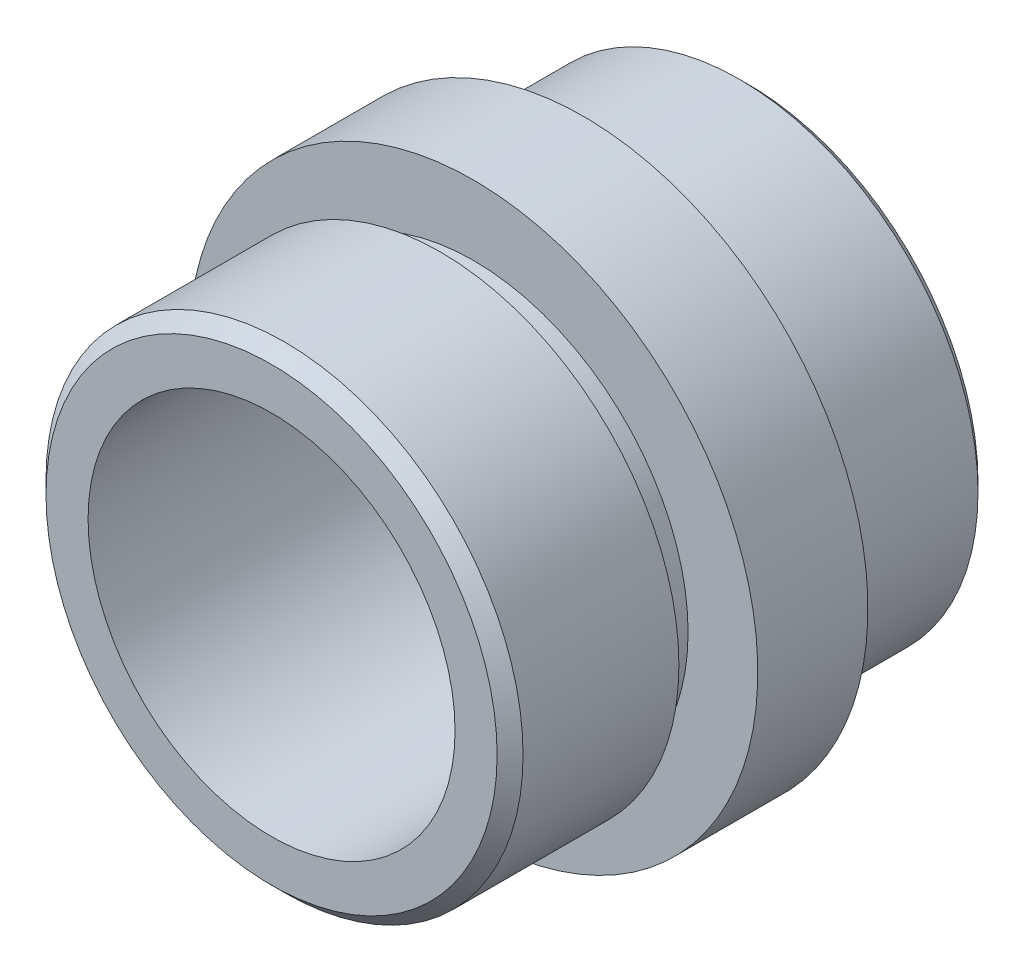
ISO-10303-21;
HEADER;
FILE_DESCRIPTION(('STEP AP214'),'2;1');
FILE_NAME('part.step','',(''),(''),'','','');
FILE_SCHEMA(('AUTOMOTIVE_DESIGN { 1 0 10303 214 1 1 1 1 }'));
ENDSEC;
DATA;
#1=APPLICATION_CONTEXT('core data for automotive mechanical design processes');
#2=APPLICATION_PROTOCOL_DEFINITION('international standard','automotive_design',2000,#1);
#3=PRODUCT_CONTEXT('',#1,'mechanical');
#4=PRODUCT('Part','Part','',(#3));
#5=PRODUCT_RELATED_PRODUCT_CATEGORY('part','',(#4));
#6=PRODUCT_DEFINITION_FORMATION('','',#4);
#7=PRODUCT_DEFINITION_CONTEXT('part definition',#1,'design');
#8=PRODUCT_DEFINITION('design','',#6,#7);
#9=PRODUCT_DEFINITION_SHAPE('','',#8);
#10=(LENGTH_UNIT() NAMED_UNIT(*) SI_UNIT(.MILLI.,.METRE.));
#11=(NAMED_UNIT(*) PLANE_ANGLE_UNIT() SI_UNIT($,.RADIAN.));
#12=(NAMED_UNIT(*) SI_UNIT($,.STERADIAN.) SOLID_ANGLE_UNIT());
#13=UNCERTAINTY_MEASURE_WITH_UNIT(LENGTH_MEASURE(1.E-05),#10,'distance_accuracy_value','');
#14=(GEOMETRIC_REPRESENTATION_CONTEXT(3) GLOBAL_UNCERTAINTY_ASSIGNED_CONTEXT((#13)) GLOBAL_UNIT_ASSIGNED_CONTEXT((#10,
#11,#12)) REPRESENTATION_CONTEXT('',''));
#15=CARTESIAN_POINT('',(0.,0.,0.));
#16=DIRECTION('',(0.,0.,1.));
#17=DIRECTION('',(1.,0.,0.));
#18=AXIS2_PLACEMENT_3D('',#15,#16,#17);
#19=CARTESIAN_POINT('',(0.,0.,26.005));
#20=DIRECTION('',(0.,0.,-1.));
#21=DIRECTION('',(-1.,0.,0.));
#22=AXIS2_PLACEMENT_3D('',#19,#20,#21);
#23=CYLINDRICAL_SURFACE('',#22,11.7);
#24=CARTESIAN_POINT('',(0.,0.,16.8));
#25=DIRECTION('',(0.,0.,-1.));
#26=DIRECTION('',(-1.,0.,0.));
#27=AXIS2_PLACEMENT_3D('',#24,#25,#26);
#28=CIRCLE('',#27,11.7);
#29=CARTESIAN_POINT('',(-11.7,0.,16.8));
#30=VERTEX_POINT('',#29);
#31=EDGE_CURVE('E84',#30,#30,#28,.T.);
#32=ORIENTED_EDGE('',*,*,#31,.T.);
#33=EDGE_LOOP('',(#32));
#34=FACE_BOUND('',#33,.T.);
#35=CARTESIAN_POINT('',(0.,0.,15.));
#36=DIRECTION('',(0.,0.,-1.));
#37=DIRECTION('',(-1.,0.,0.));
#38=AXIS2_PLACEMENT_3D('',#35,#36,#37);
#39=CIRCLE('',#38,11.7);
#40=CARTESIAN_POINT('',(-11.7,0.,15.));
#41=VERTEX_POINT('',#40);
#42=EDGE_CURVE('E10',#41,#41,#39,.T.);
#43=ORIENTED_EDGE('',*,*,#42,.F.);
#44=EDGE_LOOP('',(#43));
#45=FACE_BOUND('',#44,.T.);
#46=ADVANCED_FACE('F35',(#34,#45),#23,.T.);
#47=CARTESIAN_POINT('',(15.5,0.,15.));
#48=DIRECTION('',(0.,0.,1.));
#49=DIRECTION('',(1.,0.,0.));
#50=AXIS2_PLACEMENT_3D('',#47,#48,#49);
#51=PLANE('',#50);
#52=ORIENTED_EDGE('',*,*,#42,.T.);
#53=EDGE_LOOP('',(#52));
#54=FACE_BOUND('',#53,.T.);
#55=CARTESIAN_POINT('',(0.,0.,15.));
#56=DIRECTION('',(0.,0.,-1.));
#57=DIRECTION('',(-1.,0.,0.));
#58=AXIS2_PLACEMENT_3D('',#55,#56,#57);
#59=CIRCLE('',#58,15.5);
#60=CARTESIAN_POINT('',(-15.5,0.,15.));
#61=VERTEX_POINT('',#60);
#62=EDGE_CURVE('E41',#61,#61,#59,.T.);
#63=ORIENTED_EDGE('',*,*,#62,.F.);
#64=EDGE_LOOP('',(#63));
#65=FACE_BOUND('',#64,.T.);
#66=ADVANCED_FACE('F102',(#54,#65),#51,.T.);
#67=CARTESIAN_POINT('',(0.,0.,26.005));
#68=DIRECTION('',(0.,0.,-1.));
#69=DIRECTION('',(-1.,0.,0.));
#70=AXIS2_PLACEMENT_3D('',#67,#68,#69);
#71=CYLINDRICAL_SURFACE('',#70,15.5);
#72=ORIENTED_EDGE('',*,*,#62,.T.);
#73=EDGE_LOOP('',(#72));
#74=FACE_BOUND('',#73,.T.);
#75=CARTESIAN_POINT('',(0.,0.,9.));
#76=DIRECTION('',(0.,0.,-1.));
#77=DIRECTION('',(-1.,0.,0.));
#78=AXIS2_PLACEMENT_3D('',#75,#76,#77);
#79=CIRCLE('',#78,15.5);
#80=CARTESIAN_POINT('',(-15.5,0.,9.));
#81=VERTEX_POINT('',#80);
#82=EDGE_CURVE('E45',#81,#81,#79,.T.);
#83=ORIENTED_EDGE('',*,*,#82,.F.);
#84=EDGE_LOOP('',(#83));
#85=FACE_BOUND('',#84,.T.);
#86=ADVANCED_FACE('F106',(#74,#85),#71,.T.);
#87=CARTESIAN_POINT('',(11.7,0.,9.));
#88=DIRECTION('',(0.,0.,-1.));
#89=DIRECTION('',(-1.,0.,0.));
#90=AXIS2_PLACEMENT_3D('',#87,#88,#89);
#91=PLANE('',#90);
#92=ORIENTED_EDGE('',*,*,#82,.T.);
#93=EDGE_LOOP('',(#92));
#94=FACE_BOUND('',#93,.T.);
#95=CARTESIAN_POINT('',(0.,0.,9.));
#96=DIRECTION('',(0.,0.,-1.));
#97=DIRECTION('',(-1.,0.,0.));
#98=AXIS2_PLACEMENT_3D('',#95,#96,#97);
#99=CIRCLE('',#98,11.7);
#100=CARTESIAN_POINT('',(-11.7,0.,9.));
#101=VERTEX_POINT('',#100);
#102=EDGE_CURVE('E49',#101,#101,#99,.T.);
#103=ORIENTED_EDGE('',*,*,#102,.F.);
#104=EDGE_LOOP('',(#103));
#105=FACE_BOUND('',#104,.T.);
#106=ADVANCED_FACE('F110',(#94,#105),#91,.T.);
#107=CARTESIAN_POINT('',(0.,0.,26.005));
#108=DIRECTION('',(0.,0.,-1.));
#109=DIRECTION('',(-1.,0.,0.));
#110=AXIS2_PLACEMENT_3D('',#107,#108,#109);
#111=CYLINDRICAL_SURFACE('',#110,11.7);
#112=ORIENTED_EDGE('',*,*,#102,.T.);
#113=EDGE_LOOP('',(#112));
#114=FACE_BOUND('',#113,.T.);
#115=CARTESIAN_POINT('',(0.,0.,7.7));
#116=DIRECTION('',(0.,0.,-1.));
#117=DIRECTION('',(-1.,0.,0.));
#118=AXIS2_PLACEMENT_3D('',#115,#116,#117);
#119=CIRCLE('',#118,11.7);
#120=CARTESIAN_POINT('',(-11.7,0.,7.7));
#121=VERTEX_POINT('',#120);
#122=EDGE_CURVE('E54',#121,#121,#119,.T.);
#123=ORIENTED_EDGE('',*,*,#122,.F.);
#124=EDGE_LOOP('',(#123));
#125=FACE_BOUND('',#124,.T.);
#126=ADVANCED_FACE('F116',(#114,#125),#111,.T.);
#127=CARTESIAN_POINT('',(13.,0.,7.7));
#128=DIRECTION('',(0.,0.,1.));
#129=DIRECTION('',(1.,0.,0.));
#130=AXIS2_PLACEMENT_3D('',#127,#128,#129);
#131=PLANE('',#130);
#132=ORIENTED_EDGE('',*,*,#122,.T.);
#133=EDGE_LOOP('',(#132));
#134=FACE_BOUND('',#133,.T.);
#135=CARTESIAN_POINT('',(0.,0.,7.7));
#136=DIRECTION('',(0.,0.,-1.));
#137=DIRECTION('',(-1.,0.,0.));
#138=AXIS2_PLACEMENT_3D('',#135,#136,#137);
#139=CIRCLE('',#138,13.);
#140=CARTESIAN_POINT('',(-13.,0.,7.7));
#141=VERTEX_POINT('',#140);
#142=EDGE_CURVE('E57',#141,#141,#139,.T.);
#143=ORIENTED_EDGE('',*,*,#142,.F.);
#144=EDGE_LOOP('',(#143));
#145=FACE_BOUND('',#144,.T.);
#146=ADVANCED_FACE('F120',(#134,#145),#131,.T.);
#147=CARTESIAN_POINT('',(0.,0.,26.005));
#148=DIRECTION('',(0.,0.,-1.));
#149=DIRECTION('',(-1.,0.,0.));
#150=AXIS2_PLACEMENT_3D('',#147,#148,#149);
#151=CYLINDRICAL_SURFACE('',#150,13.);
#152=ORIENTED_EDGE('',*,*,#142,.T.);
#153=EDGE_LOOP('',(#152));
#154=FACE_BOUND('',#153,.T.);
#155=CARTESIAN_POINT('',(0.,0.,0.500000000000004));
#156=DIRECTION('',(0.,0.,-1.));
#157=DIRECTION('',(-1.,0.,0.));
#158=AXIS2_PLACEMENT_3D('',#155,#156,#157);
#159=CIRCLE('',#158,13.);
#160=CARTESIAN_POINT('',(-13.,0.,0.500000000000004));
#161=VERTEX_POINT('',#160);
#162=EDGE_CURVE('E60',#161,#161,#159,.T.);
#163=ORIENTED_EDGE('',*,*,#162,.F.);
#164=EDGE_LOOP('',(#163));
#165=FACE_BOUND('',#164,.T.);
#166=ADVANCED_FACE('F124',(#154,#165),#151,.T.);
#167=CARTESIAN_POINT('',(0.,0.,0.));
#168=DIRECTION('',(0.,0.,1.));
#169=DIRECTION('',(1.,0.,0.));
#170=AXIS2_PLACEMENT_3D('',#167,#168,#169);
#171=CONICAL_SURFACE('',#170,12.5,0.785398163397447);
#172=ORIENTED_EDGE('',*,*,#162,.T.);
#173=EDGE_LOOP('',(#172));
#174=FACE_BOUND('',#173,.T.);
#175=CARTESIAN_POINT('',(0.,0.,0.));
#176=DIRECTION('',(0.,0.,-1.));
#177=DIRECTION('',(-1.,0.,0.));
#178=AXIS2_PLACEMENT_3D('',#175,#176,#177);
#179=CIRCLE('',#178,12.5);
#180=CARTESIAN_POINT('',(-12.5,0.,0.));
#181=VERTEX_POINT('',#180);
#182=EDGE_CURVE('E63',#181,#181,#179,.T.);
#183=ORIENTED_EDGE('',*,*,#182,.F.);
#184=EDGE_LOOP('',(#183));
#185=FACE_BOUND('',#184,.T.);
#186=ADVANCED_FACE('F128',(#174,#185),#171,.T.);
#187=CARTESIAN_POINT('',(11.,0.,0.));
#188=DIRECTION('',(0.,0.,-1.));
#189=DIRECTION('',(-1.,0.,0.));
#190=AXIS2_PLACEMENT_3D('',#187,#188,#189);
#191=PLANE('',#190);
#192=ORIENTED_EDGE('',*,*,#182,.T.);
#193=EDGE_LOOP('',(#192));
#194=FACE_BOUND('',#193,.T.);
#195=CARTESIAN_POINT('',(0.,0.,0.));
#196=DIRECTION('',(0.,0.,-1.));
#197=DIRECTION('',(-1.,0.,0.));
#198=AXIS2_PLACEMENT_3D('',#195,#196,#197);
#199=CIRCLE('',#198,11.);
#200=CARTESIAN_POINT('',(-11.,0.,0.));
#201=VERTEX_POINT('',#200);
#202=EDGE_CURVE('E66',#201,#201,#199,.T.);
#203=ORIENTED_EDGE('',*,*,#202,.F.);
#204=EDGE_LOOP('',(#203));
#205=FACE_BOUND('',#204,.T.);
#206=ADVANCED_FACE('F132',(#194,#205),#191,.T.);
#207=CARTESIAN_POINT('',(0.,0.,1.));
#208=DIRECTION('',(0.,0.,-1.));
#209=DIRECTION('',(-1.,0.,0.));
#210=AXIS2_PLACEMENT_3D('',#207,#208,#209);
#211=CONICAL_SURFACE('',#210,10.,0.785398163397447);
#212=ORIENTED_EDGE('',*,*,#202,.T.);
#213=EDGE_LOOP('',(#212));
#214=FACE_BOUND('',#213,.T.);
#215=CARTESIAN_POINT('',(0.,0.,1.));
#216=DIRECTION('',(0.,0.,-1.));
#217=DIRECTION('',(-1.,0.,0.));
#218=AXIS2_PLACEMENT_3D('',#215,#216,#217);
#219=CIRCLE('',#218,10.);
#220=CARTESIAN_POINT('',(-10.,0.,1.));
#221=VERTEX_POINT('',#220);
#222=EDGE_CURVE('E69',#221,#221,#219,.T.);
#223=ORIENTED_EDGE('',*,*,#222,.F.);
#224=EDGE_LOOP('',(#223));
#225=FACE_BOUND('',#224,.T.);
#226=ADVANCED_FACE('F136',(#214,#225),#211,.F.);
#227=CARTESIAN_POINT('',(0.,0.,26.005));
#228=DIRECTION('',(0.,0.,-1.));
#229=DIRECTION('',(-1.,0.,0.));
#230=AXIS2_PLACEMENT_3D('',#227,#228,#229);
#231=CYLINDRICAL_SURFACE('',#230,10.);
#232=ORIENTED_EDGE('',*,*,#222,.T.);
#233=EDGE_LOOP('',(#232));
#234=FACE_BOUND('',#233,.T.);
#235=CARTESIAN_POINT('',(0.,0.,26.));
#236=DIRECTION('',(0.,0.,-1.));
#237=DIRECTION('',(-1.,0.,0.));
#238=AXIS2_PLACEMENT_3D('',#235,#236,#237);
#239=CIRCLE('',#238,10.);
#240=CARTESIAN_POINT('',(-10.,0.,26.));
#241=VERTEX_POINT('',#240);
#242=EDGE_CURVE('E72',#241,#241,#239,.T.);
#243=ORIENTED_EDGE('',*,*,#242,.F.);
#244=EDGE_LOOP('',(#243));
#245=FACE_BOUND('',#244,.T.);
#246=ADVANCED_FACE('F140',(#234,#245),#231,.F.);
#247=CARTESIAN_POINT('',(12.292893218813,0.,26.));
#248=DIRECTION('',(0.,0.,1.));
#249=DIRECTION('',(1.,0.,0.));
#250=AXIS2_PLACEMENT_3D('',#247,#248,#249);
#251=PLANE('',#250);
#252=ORIENTED_EDGE('',*,*,#242,.T.);
#253=EDGE_LOOP('',(#252));
#254=FACE_BOUND('',#253,.T.);
#255=CARTESIAN_POINT('',(0.,0.,26.));
#256=DIRECTION('',(0.,0.,-1.));
#257=DIRECTION('',(-1.,0.,0.));
#258=AXIS2_PLACEMENT_3D('',#255,#256,#257);
#259=CIRCLE('',#258,12.292893218813);
#260=CARTESIAN_POINT('',(-12.292893218813,0.,26.));
#261=VERTEX_POINT('',#260);
#262=EDGE_CURVE('E75',#261,#261,#259,.T.);
#263=ORIENTED_EDGE('',*,*,#262,.F.);
#264=EDGE_LOOP('',(#263));
#265=FACE_BOUND('',#264,.T.);
#266=ADVANCED_FACE('F144',(#254,#265),#251,.T.);
#267=CARTESIAN_POINT('',(0.,0.,25.292893218813));
#268=DIRECTION('',(0.,0.,-1.));
#269=DIRECTION('',(-1.,0.,0.));
#270=AXIS2_PLACEMENT_3D('',#267,#268,#269);
#271=CONICAL_SURFACE('',#270,13.,0.785398163397447);
#272=ORIENTED_EDGE('',*,*,#262,.T.);
#273=EDGE_LOOP('',(#272));
#274=FACE_BOUND('',#273,.T.);
#275=CARTESIAN_POINT('',(0.,0.,25.292893218813));
#276=DIRECTION('',(0.,0.,-1.));
#277=DIRECTION('',(-1.,0.,0.));
#278=AXIS2_PLACEMENT_3D('',#275,#276,#277);
#279=CIRCLE('',#278,13.);
#280=CARTESIAN_POINT('',(-13.,0.,25.292893218813));
#281=VERTEX_POINT('',#280);
#282=EDGE_CURVE('E78',#281,#281,#279,.T.);
#283=ORIENTED_EDGE('',*,*,#282,.F.);
#284=EDGE_LOOP('',(#283));
#285=FACE_BOUND('',#284,.T.);
#286=ADVANCED_FACE('F98',(#274,#285),#271,.T.);
#287=CARTESIAN_POINT('',(0.,0.,26.005));
#288=DIRECTION('',(0.,0.,-1.));
#289=DIRECTION('',(-1.,0.,0.));
#290=AXIS2_PLACEMENT_3D('',#287,#288,#289);
#291=CYLINDRICAL_SURFACE('',#290,13.);
#292=ORIENTED_EDGE('',*,*,#282,.T.);
#293=EDGE_LOOP('',(#292));
#294=FACE_BOUND('',#293,.T.);
#295=CARTESIAN_POINT('',(0.,0.,16.8));
#296=DIRECTION('',(0.,0.,-1.));
#297=DIRECTION('',(-1.,0.,0.));
#298=AXIS2_PLACEMENT_3D('',#295,#296,#297);
#299=CIRCLE('',#298,13.);
#300=CARTESIAN_POINT('',(-13.,0.,16.8));
#301=VERTEX_POINT('',#300);
#302=EDGE_CURVE('E81',#301,#301,#299,.T.);
#303=ORIENTED_EDGE('',*,*,#302,.F.);
#304=EDGE_LOOP('',(#303));
#305=FACE_BOUND('',#304,.T.);
#306=ADVANCED_FACE('F92',(#294,#305),#291,.T.);
#307=CARTESIAN_POINT('',(11.7,0.,16.8));
#308=DIRECTION('',(0.,0.,-1.));
#309=DIRECTION('',(-1.,0.,0.));
#310=AXIS2_PLACEMENT_3D('',#307,#308,#309);
#311=PLANE('',#310);
#312=ORIENTED_EDGE('',*,*,#302,.T.);
#313=EDGE_LOOP('',(#312));
#314=FACE_BOUND('',#313,.T.);
#315=ORIENTED_EDGE('',*,*,#31,.F.);
#316=EDGE_LOOP('',(#315));
#317=FACE_BOUND('',#316,.T.);
#318=ADVANCED_FACE('F90',(#314,#317),#311,.T.);
#319=CLOSED_SHELL('',(#46,#66,#86,#106,#126,#146,#166,#186,#206,#226,#246,#266,#286,#306,#318));
#320=MANIFOLD_SOLID_BREP('B2',#319);
#321=ADVANCED_BREP_SHAPE_REPRESENTATION('',(#18,#320),#14);
#322=SHAPE_DEFINITION_REPRESENTATION(#9,#321);
ENDSEC;
END-ISO-10303-21;
